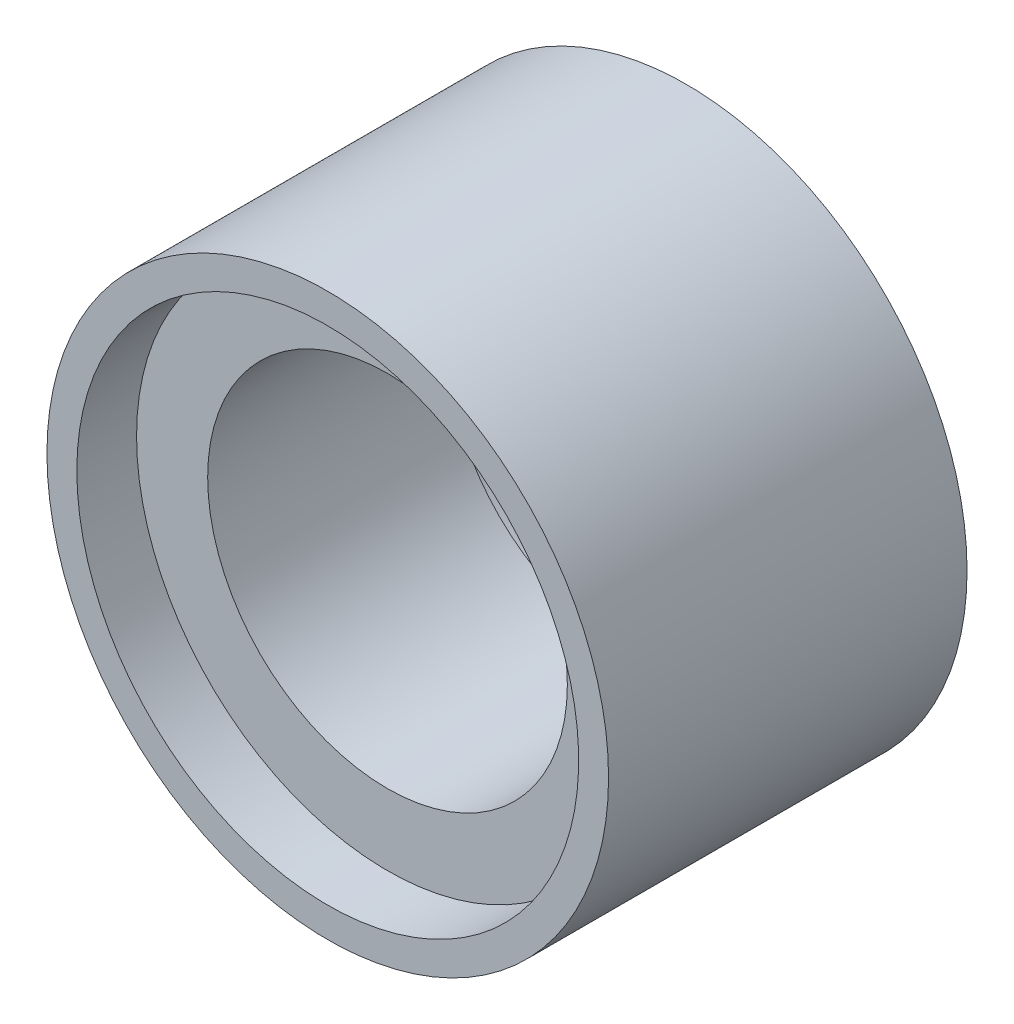
ISO-10303-21;
HEADER;
FILE_DESCRIPTION(('STEP AP214'),'2;1');
FILE_NAME('part.step','',(''),(''),'','','');
FILE_SCHEMA(('AUTOMOTIVE_DESIGN { 1 0 10303 214 1 1 1 1 }'));
ENDSEC;
DATA;
#1=APPLICATION_CONTEXT('core data for automotive mechanical design processes');
#2=APPLICATION_PROTOCOL_DEFINITION('international standard','automotive_design',2000,#1);
#3=PRODUCT_CONTEXT('',#1,'mechanical');
#4=PRODUCT('Part','Part','',(#3));
#5=PRODUCT_RELATED_PRODUCT_CATEGORY('part','',(#4));
#6=PRODUCT_DEFINITION_FORMATION('','',#4);
#7=PRODUCT_DEFINITION_CONTEXT('part definition',#1,'design');
#8=PRODUCT_DEFINITION('design','',#6,#7);
#9=PRODUCT_DEFINITION_SHAPE('','',#8);
#10=(LENGTH_UNIT() NAMED_UNIT(*) SI_UNIT(.MILLI.,.METRE.));
#11=(NAMED_UNIT(*) PLANE_ANGLE_UNIT() SI_UNIT($,.RADIAN.));
#12=(NAMED_UNIT(*) SI_UNIT($,.STERADIAN.) SOLID_ANGLE_UNIT());
#13=UNCERTAINTY_MEASURE_WITH_UNIT(LENGTH_MEASURE(1.E-05),#10,'distance_accuracy_value','');
#14=(GEOMETRIC_REPRESENTATION_CONTEXT(3) GLOBAL_UNCERTAINTY_ASSIGNED_CONTEXT((#13)) GLOBAL_UNIT_ASSIGNED_CONTEXT((#10,
#11,#12)) REPRESENTATION_CONTEXT('',''));
#15=CARTESIAN_POINT('',(0.,0.,0.));
#16=DIRECTION('',(0.,0.,1.));
#17=DIRECTION('',(1.,0.,0.));
#18=AXIS2_PLACEMENT_3D('',#15,#16,#17);
#19=CARTESIAN_POINT('',(0.,0.,10.));
#20=DIRECTION('',(0.,0.,1.));
#21=DIRECTION('',(1.,0.,0.));
#22=AXIS2_PLACEMENT_3D('',#19,#20,#21);
#23=PLANE('',#22);
#24=CARTESIAN_POINT('',(0.,0.,10.));
#25=DIRECTION('',(0.,0.,1.));
#26=DIRECTION('',(1.,0.,0.));
#27=AXIS2_PLACEMENT_3D('',#24,#25,#26);
#28=CIRCLE('',#27,15.05);
#29=CARTESIAN_POINT('',(15.05,0.,10.));
#30=VERTEX_POINT('',#29);
#31=EDGE_CURVE('E10',#30,#30,#28,.T.);
#32=ORIENTED_EDGE('',*,*,#31,.F.);
#33=EDGE_LOOP('',(#32));
#34=FACE_BOUND('',#33,.T.);
#35=CARTESIAN_POINT('',(0.,0.,10.));
#36=DIRECTION('',(0.,0.,-1.));
#37=DIRECTION('',(-1.,0.,0.));
#38=AXIS2_PLACEMENT_3D('',#35,#36,#37);
#39=CIRCLE('',#38,21.);
#40=CARTESIAN_POINT('',(-21.,0.,10.));
#41=VERTEX_POINT('',#40);
#42=EDGE_CURVE('E56',#41,#41,#39,.T.);
#43=ORIENTED_EDGE('',*,*,#42,.F.);
#44=EDGE_LOOP('',(#43));
#45=FACE_BOUND('',#44,.T.);
#46=ADVANCED_FACE('F31',(#34,#45),#23,.T.);
#47=CARTESIAN_POINT('',(0.,0.,-10.));
#48=DIRECTION('',(0.,0.,1.));
#49=DIRECTION('',(1.,0.,0.));
#50=AXIS2_PLACEMENT_3D('',#47,#48,#49);
#51=PLANE('',#50);
#52=CARTESIAN_POINT('',(0.,0.,-10.));
#53=DIRECTION('',(0.,0.,1.));
#54=DIRECTION('',(1.,0.,0.));
#55=AXIS2_PLACEMENT_3D('',#52,#53,#54);
#56=CIRCLE('',#55,15.05);
#57=CARTESIAN_POINT('',(15.05,0.,-10.));
#58=VERTEX_POINT('',#57);
#59=EDGE_CURVE('E35',#58,#58,#56,.T.);
#60=ORIENTED_EDGE('',*,*,#59,.T.);
#61=EDGE_LOOP('',(#60));
#62=FACE_BOUND('',#61,.T.);
#63=CARTESIAN_POINT('',(0.,0.,-10.));
#64=DIRECTION('',(0.,0.,-1.));
#65=DIRECTION('',(-1.,0.,0.));
#66=AXIS2_PLACEMENT_3D('',#63,#64,#65);
#67=CIRCLE('',#66,21.);
#68=CARTESIAN_POINT('',(-21.,0.,-10.));
#69=VERTEX_POINT('',#68);
#70=EDGE_CURVE('E47',#69,#69,#67,.T.);
#71=ORIENTED_EDGE('',*,*,#70,.T.);
#72=EDGE_LOOP('',(#71));
#73=FACE_BOUND('',#72,.T.);
#74=ADVANCED_FACE('F72',(#62,#73),#51,.F.);
#75=CARTESIAN_POINT('',(0.,0.,10.));
#76=DIRECTION('',(0.,0.,-1.));
#77=DIRECTION('',(-1.,0.,0.));
#78=AXIS2_PLACEMENT_3D('',#75,#76,#77);
#79=CYLINDRICAL_SURFACE('',#78,23.5);
#80=CARTESIAN_POINT('',(0.,0.,-15.));
#81=DIRECTION('',(0.,0.,-1.));
#82=DIRECTION('',(-1.,0.,0.));
#83=AXIS2_PLACEMENT_3D('',#80,#81,#82);
#84=CIRCLE('',#83,23.5);
#85=CARTESIAN_POINT('',(-23.5,0.,-15.));
#86=VERTEX_POINT('',#85);
#87=EDGE_CURVE('E42',#86,#86,#84,.T.);
#88=ORIENTED_EDGE('',*,*,#87,.F.);
#89=EDGE_LOOP('',(#88));
#90=FACE_BOUND('',#89,.T.);
#91=CARTESIAN_POINT('',(0.,0.,15.));
#92=DIRECTION('',(0.,0.,-1.));
#93=DIRECTION('',(-1.,0.,0.));
#94=AXIS2_PLACEMENT_3D('',#91,#92,#93);
#95=CIRCLE('',#94,23.5);
#96=CARTESIAN_POINT('',(-23.5,0.,15.));
#97=VERTEX_POINT('',#96);
#98=EDGE_CURVE('E50',#97,#97,#95,.T.);
#99=ORIENTED_EDGE('',*,*,#98,.T.);
#100=EDGE_LOOP('',(#99));
#101=FACE_BOUND('',#100,.T.);
#102=ADVANCED_FACE('F33',(#90,#101),#79,.T.);
#103=CARTESIAN_POINT('',(0.,0.,10.));
#104=DIRECTION('',(0.,0.,-1.));
#105=DIRECTION('',(-1.,0.,0.));
#106=AXIS2_PLACEMENT_3D('',#103,#104,#105);
#107=CYLINDRICAL_SURFACE('',#106,15.05);
#108=ORIENTED_EDGE('',*,*,#31,.T.);
#109=EDGE_LOOP('',(#108));
#110=FACE_BOUND('',#109,.T.);
#111=ORIENTED_EDGE('',*,*,#59,.F.);
#112=EDGE_LOOP('',(#111));
#113=FACE_BOUND('',#112,.T.);
#114=ADVANCED_FACE('F80',(#110,#113),#107,.F.);
#115=CARTESIAN_POINT('',(0.,0.,-15.));
#116=DIRECTION('',(0.,0.,-1.));
#117=DIRECTION('',(-1.,0.,0.));
#118=AXIS2_PLACEMENT_3D('',#115,#116,#117);
#119=PLANE('',#118);
#120=ORIENTED_EDGE('',*,*,#87,.T.);
#121=EDGE_LOOP('',(#120));
#122=FACE_BOUND('',#121,.T.);
#123=CARTESIAN_POINT('',(0.,0.,-15.));
#124=DIRECTION('',(0.,0.,-1.));
#125=DIRECTION('',(-1.,0.,0.));
#126=AXIS2_PLACEMENT_3D('',#123,#124,#125);
#127=CIRCLE('',#126,21.);
#128=CARTESIAN_POINT('',(-21.,0.,-15.));
#129=VERTEX_POINT('',#128);
#130=EDGE_CURVE('E46',#129,#129,#127,.T.);
#131=ORIENTED_EDGE('',*,*,#130,.F.);
#132=EDGE_LOOP('',(#131));
#133=FACE_BOUND('',#132,.T.);
#134=ADVANCED_FACE('F83',(#122,#133),#119,.T.);
#135=CARTESIAN_POINT('',(0.,0.,-15.));
#136=DIRECTION('',(0.,0.,1.));
#137=DIRECTION('',(1.,0.,0.));
#138=AXIS2_PLACEMENT_3D('',#135,#136,#137);
#139=CYLINDRICAL_SURFACE('',#138,21.);
#140=ORIENTED_EDGE('',*,*,#130,.T.);
#141=EDGE_LOOP('',(#140));
#142=FACE_BOUND('',#141,.T.);
#143=ORIENTED_EDGE('',*,*,#70,.F.);
#144=EDGE_LOOP('',(#143));
#145=FACE_BOUND('',#144,.T.);
#146=ADVANCED_FACE('F86',(#142,#145),#139,.F.);
#147=CARTESIAN_POINT('',(0.,0.,15.));
#148=DIRECTION('',(0.,0.,1.));
#149=DIRECTION('',(-1.,0.,0.));
#150=AXIS2_PLACEMENT_3D('',#147,#148,#149);
#151=PLANE('',#150);
#152=CARTESIAN_POINT('',(0.,0.,15.));
#153=DIRECTION('',(0.,0.,-1.));
#154=DIRECTION('',(-1.,0.,0.));
#155=AXIS2_PLACEMENT_3D('',#152,#153,#154);
#156=CIRCLE('',#155,21.);
#157=CARTESIAN_POINT('',(-21.,0.,15.));
#158=VERTEX_POINT('',#157);
#159=EDGE_CURVE('E55',#158,#158,#156,.T.);
#160=ORIENTED_EDGE('',*,*,#159,.T.);
#161=EDGE_LOOP('',(#160));
#162=FACE_BOUND('',#161,.T.);
#163=ORIENTED_EDGE('',*,*,#98,.F.);
#164=EDGE_LOOP('',(#163));
#165=FACE_BOUND('',#164,.T.);
#166=ADVANCED_FACE('F62',(#162,#165),#151,.T.);
#167=CARTESIAN_POINT('',(0.,0.,15.));
#168=DIRECTION('',(0.,0.,-1.));
#169=DIRECTION('',(-1.,0.,0.));
#170=AXIS2_PLACEMENT_3D('',#167,#168,#169);
#171=CYLINDRICAL_SURFACE('',#170,21.);
#172=ORIENTED_EDGE('',*,*,#159,.F.);
#173=EDGE_LOOP('',(#172));
#174=FACE_BOUND('',#173,.T.);
#175=ORIENTED_EDGE('',*,*,#42,.T.);
#176=EDGE_LOOP('',(#175));
#177=FACE_BOUND('',#176,.T.);
#178=ADVANCED_FACE('F65',(#174,#177),#171,.F.);
#179=CLOSED_SHELL('',(#46,#74,#102,#114,#134,#146,#166,#178));
#180=MANIFOLD_SOLID_BREP('B2',#179);
#181=ADVANCED_BREP_SHAPE_REPRESENTATION('',(#18,#180),#14);
#182=SHAPE_DEFINITION_REPRESENTATION(#9,#181);
ENDSEC;
END-ISO-10303-21;
